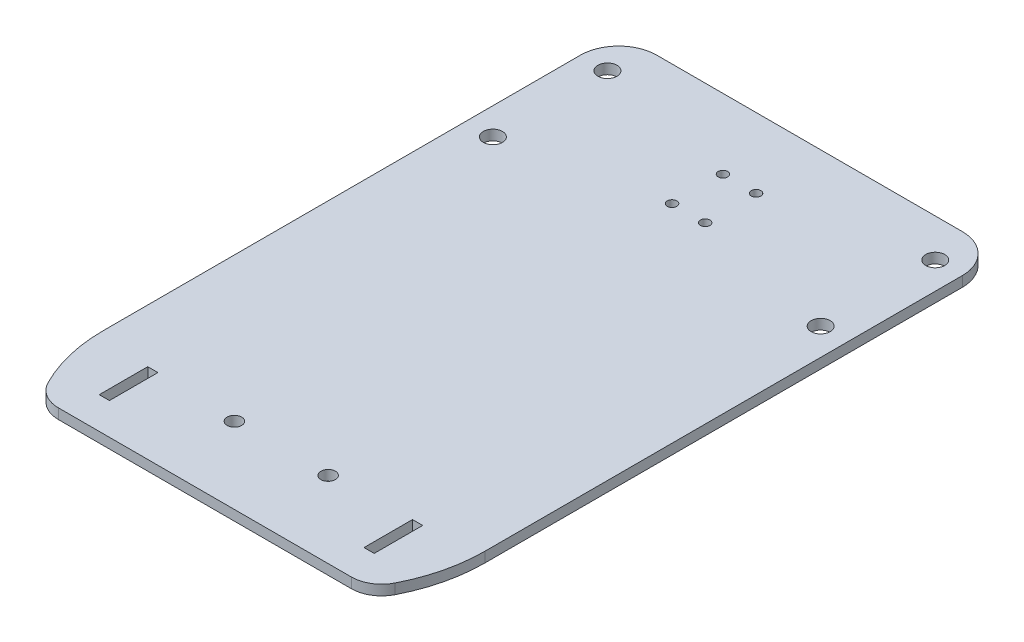
ISO-10303-21;
HEADER;
FILE_DESCRIPTION(('STEP AP214'),'2;1');
FILE_NAME('part.step','',(''),(''),'','','');
FILE_SCHEMA(('AUTOMOTIVE_DESIGN { 1 0 10303 214 1 1 1 1 }'));
ENDSEC;
DATA;
#1=APPLICATION_CONTEXT('core data for automotive mechanical design processes');
#2=APPLICATION_PROTOCOL_DEFINITION('international standard','automotive_design',2000,#1);
#3=PRODUCT_CONTEXT('',#1,'mechanical');
#4=PRODUCT('Part','Part','',(#3));
#5=PRODUCT_RELATED_PRODUCT_CATEGORY('part','',(#4));
#6=PRODUCT_DEFINITION_FORMATION('','',#4);
#7=PRODUCT_DEFINITION_CONTEXT('part definition',#1,'design');
#8=PRODUCT_DEFINITION('design','',#6,#7);
#9=PRODUCT_DEFINITION_SHAPE('','',#8);
#10=(LENGTH_UNIT() NAMED_UNIT(*) SI_UNIT(.MILLI.,.METRE.));
#11=(NAMED_UNIT(*) PLANE_ANGLE_UNIT() SI_UNIT($,.RADIAN.));
#12=(NAMED_UNIT(*) SI_UNIT($,.STERADIAN.) SOLID_ANGLE_UNIT());
#13=UNCERTAINTY_MEASURE_WITH_UNIT(LENGTH_MEASURE(1.E-05),#10,'distance_accuracy_value','');
#14=(GEOMETRIC_REPRESENTATION_CONTEXT(3) GLOBAL_UNCERTAINTY_ASSIGNED_CONTEXT((#13)) GLOBAL_UNIT_ASSIGNED_CONTEXT((#10,
#11,#12)) REPRESENTATION_CONTEXT('',''));
#15=CARTESIAN_POINT('',(0.,0.,0.));
#16=DIRECTION('',(0.,0.,1.));
#17=DIRECTION('',(1.,0.,0.));
#18=AXIS2_PLACEMENT_3D('',#15,#16,#17);
#19=CARTESIAN_POINT('',(-30.,0.8,0.));
#20=DIRECTION('',(1.,0.,0.));
#21=DIRECTION('',(0.,0.,-1.));
#22=AXIS2_PLACEMENT_3D('',#19,#20,#21);
#23=PLANE('',#22);
#24=DIRECTION('',(0.,0.,1.));
#25=VECTOR('',#24,1.);
#26=CARTESIAN_POINT('',(-30.,-0.8,0.));
#27=LINE('',#26,#25);
#28=CARTESIAN_POINT('',(-30.,-0.8,6.));
#29=VERTEX_POINT('',#28);
#30=CARTESIAN_POINT('',(-30.,-0.8,81.));
#31=VERTEX_POINT('',#30);
#32=EDGE_CURVE('E269',#29,#31,#27,.T.);
#33=ORIENTED_EDGE('',*,*,#32,.T.);
#34=DIRECTION('',(0.,1.,0.));
#35=VECTOR('',#34,1.);
#36=CARTESIAN_POINT('',(-30.,-0.8,81.));
#37=LINE('',#36,#35);
#38=CARTESIAN_POINT('',(-30.,0.8,81.));
#39=VERTEX_POINT('',#38);
#40=EDGE_CURVE('E266',#31,#39,#37,.T.);
#41=ORIENTED_EDGE('',*,*,#40,.T.);
#42=DIRECTION('',(0.,0.,1.));
#43=VECTOR('',#42,1.);
#44=CARTESIAN_POINT('',(-30.,0.8,0.));
#45=LINE('',#44,#43);
#46=CARTESIAN_POINT('',(-30.,0.8,6.));
#47=VERTEX_POINT('',#46);
#48=EDGE_CURVE('E290',#47,#39,#45,.T.);
#49=ORIENTED_EDGE('',*,*,#48,.F.);
#50=DIRECTION('',(0.,1.,0.));
#51=VECTOR('',#50,1.);
#52=CARTESIAN_POINT('',(-30.,-0.8,6.));
#53=LINE('',#52,#51);
#54=EDGE_CURVE('E270',#29,#47,#53,.T.);
#55=ORIENTED_EDGE('',*,*,#54,.F.);
#56=EDGE_LOOP('',(#33,#41,#49,#55));
#57=FACE_BOUND('',#56,.T.);
#58=ADVANCED_FACE('F36',(#57),#23,.F.);
#59=CARTESIAN_POINT('',(-30.,0.8,95.));
#60=DIRECTION('',(0.,0.,-1.));
#61=DIRECTION('',(-1.,0.,0.));
#62=AXIS2_PLACEMENT_3D('',#59,#60,#61);
#63=PLANE('',#62);
#64=DIRECTION('',(1.,0.,0.));
#65=VECTOR('',#64,1.);
#66=CARTESIAN_POINT('',(-30.,-0.8,95.));
#67=LINE('',#66,#65);
#68=CARTESIAN_POINT('',(-23.,-0.8,95.));
#69=VERTEX_POINT('',#68);
#70=CARTESIAN_POINT('',(23.,-0.8,95.));
#71=VERTEX_POINT('',#70);
#72=EDGE_CURVE('E300',#69,#71,#67,.T.);
#73=ORIENTED_EDGE('',*,*,#72,.T.);
#74=DIRECTION('',(0.,1.,0.));
#75=VECTOR('',#74,1.);
#76=CARTESIAN_POINT('',(23.,-0.8,95.));
#77=LINE('',#76,#75);
#78=CARTESIAN_POINT('',(23.,0.8,95.));
#79=VERTEX_POINT('',#78);
#80=EDGE_CURVE('E284',#71,#79,#77,.T.);
#81=ORIENTED_EDGE('',*,*,#80,.T.);
#82=DIRECTION('',(1.,0.,0.));
#83=VECTOR('',#82,1.);
#84=CARTESIAN_POINT('',(-30.,0.8,95.));
#85=LINE('',#84,#83);
#86=CARTESIAN_POINT('',(-23.,0.8,95.));
#87=VERTEX_POINT('',#86);
#88=EDGE_CURVE('E293',#87,#79,#85,.T.);
#89=ORIENTED_EDGE('',*,*,#88,.F.);
#90=DIRECTION('',(0.,1.,0.));
#91=VECTOR('',#90,1.);
#92=CARTESIAN_POINT('',(-23.,-0.8,95.));
#93=LINE('',#92,#91);
#94=EDGE_CURVE('E287',#69,#87,#93,.T.);
#95=ORIENTED_EDGE('',*,*,#94,.F.);
#96=EDGE_LOOP('',(#73,#81,#89,#95));
#97=FACE_BOUND('',#96,.T.);
#98=ADVANCED_FACE('F339',(#97),#63,.F.);
#99=CARTESIAN_POINT('',(30.,0.8,0.));
#100=DIRECTION('',(-1.,0.,0.));
#101=DIRECTION('',(0.,0.,1.));
#102=AXIS2_PLACEMENT_3D('',#99,#100,#101);
#103=PLANE('',#102);
#104=DIRECTION('',(0.,0.,-1.));
#105=VECTOR('',#104,1.);
#106=CARTESIAN_POINT('',(30.,-0.8,0.));
#107=LINE('',#106,#105);
#108=CARTESIAN_POINT('',(30.,-0.8,81.));
#109=VERTEX_POINT('',#108);
#110=CARTESIAN_POINT('',(30.,-0.8,6.00000000000001));
#111=VERTEX_POINT('',#110);
#112=EDGE_CURVE('E302',#109,#111,#107,.T.);
#113=ORIENTED_EDGE('',*,*,#112,.T.);
#114=DIRECTION('',(0.,1.,0.));
#115=VECTOR('',#114,1.);
#116=CARTESIAN_POINT('',(30.,-0.8,6.00000000000001));
#117=LINE('',#116,#115);
#118=CARTESIAN_POINT('',(30.,0.8,6.00000000000001));
#119=VERTEX_POINT('',#118);
#120=EDGE_CURVE('E277',#111,#119,#117,.T.);
#121=ORIENTED_EDGE('',*,*,#120,.T.);
#122=DIRECTION('',(0.,0.,-1.));
#123=VECTOR('',#122,1.);
#124=CARTESIAN_POINT('',(30.,0.8,0.));
#125=LINE('',#124,#123);
#126=CARTESIAN_POINT('',(30.,0.8,81.));
#127=VERTEX_POINT('',#126);
#128=EDGE_CURVE('E44',#127,#119,#125,.T.);
#129=ORIENTED_EDGE('',*,*,#128,.F.);
#130=DIRECTION('',(0.,1.,0.));
#131=VECTOR('',#130,1.);
#132=CARTESIAN_POINT('',(30.,-0.8,81.));
#133=LINE('',#132,#131);
#134=EDGE_CURVE('E280',#109,#127,#133,.T.);
#135=ORIENTED_EDGE('',*,*,#134,.F.);
#136=EDGE_LOOP('',(#113,#121,#129,#135));
#137=FACE_BOUND('',#136,.T.);
#138=ADVANCED_FACE('F328',(#137),#103,.F.);
#139=CARTESIAN_POINT('',(-30.,0.8,0.));
#140=DIRECTION('',(0.,0.,1.));
#141=DIRECTION('',(1.,0.,0.));
#142=AXIS2_PLACEMENT_3D('',#139,#140,#141);
#143=PLANE('',#142);
#144=DIRECTION('',(-1.,0.,0.));
#145=VECTOR('',#144,1.);
#146=CARTESIAN_POINT('',(-30.,-0.8,0.));
#147=LINE('',#146,#145);
#148=CARTESIAN_POINT('',(24.,-0.8,0.));
#149=VERTEX_POINT('',#148);
#150=CARTESIAN_POINT('',(-24.,-0.8,0.));
#151=VERTEX_POINT('',#150);
#152=EDGE_CURVE('E39',#149,#151,#147,.T.);
#153=ORIENTED_EDGE('',*,*,#152,.T.);
#154=DIRECTION('',(0.,1.,0.));
#155=VECTOR('',#154,1.);
#156=CARTESIAN_POINT('',(-24.,-0.8,0.));
#157=LINE('',#156,#155);
#158=CARTESIAN_POINT('',(-24.,0.8,0.));
#159=VERTEX_POINT('',#158);
#160=EDGE_CURVE('E272',#151,#159,#157,.T.);
#161=ORIENTED_EDGE('',*,*,#160,.T.);
#162=DIRECTION('',(-1.,0.,0.));
#163=VECTOR('',#162,1.);
#164=CARTESIAN_POINT('',(-30.,0.8,0.));
#165=LINE('',#164,#163);
#166=CARTESIAN_POINT('',(24.,0.8,0.));
#167=VERTEX_POINT('',#166);
#168=EDGE_CURVE('E12',#167,#159,#165,.T.);
#169=ORIENTED_EDGE('',*,*,#168,.F.);
#170=DIRECTION('',(0.,1.,0.));
#171=VECTOR('',#170,1.);
#172=CARTESIAN_POINT('',(24.,-0.8,0.));
#173=LINE('',#172,#171);
#174=EDGE_CURVE('E275',#149,#167,#173,.T.);
#175=ORIENTED_EDGE('',*,*,#174,.F.);
#176=EDGE_LOOP('',(#153,#161,#169,#175));
#177=FACE_BOUND('',#176,.T.);
#178=ADVANCED_FACE('F311',(#177),#143,.F.);
#179=CARTESIAN_POINT('',(-30.,0.8,95.));
#180=DIRECTION('',(0.,1.,0.));
#181=DIRECTION('',(0.,0.,1.));
#182=AXIS2_PLACEMENT_3D('',#179,#180,#181);
#183=PLANE('',#182);
#184=CARTESIAN_POINT('',(2.60000000000001,0.8,11.));
#185=DIRECTION('',(0.,1.,0.));
#186=DIRECTION('',(0.,0.,-1.));
#187=AXIS2_PLACEMENT_3D('',#184,#185,#186);
#188=CIRCLE('',#187,0.750000000000001);
#189=CARTESIAN_POINT('',(2.60000000000001,0.8,10.25));
#190=VERTEX_POINT('',#189);
#191=EDGE_CURVE('E377',#190,#190,#188,.T.);
#192=ORIENTED_EDGE('',*,*,#191,.F.);
#193=EDGE_LOOP('',(#192));
#194=FACE_BOUND('',#193,.T.);
#195=CARTESIAN_POINT('',(2.60000000000001,0.8,19.));
#196=DIRECTION('',(0.,1.,0.));
#197=DIRECTION('',(0.,0.,-1.));
#198=AXIS2_PLACEMENT_3D('',#195,#196,#197);
#199=CIRCLE('',#198,0.750000000000001);
#200=CARTESIAN_POINT('',(2.60000000000001,0.8,18.25));
#201=VERTEX_POINT('',#200);
#202=EDGE_CURVE('E381',#201,#201,#199,.T.);
#203=ORIENTED_EDGE('',*,*,#202,.F.);
#204=EDGE_LOOP('',(#203));
#205=FACE_BOUND('',#204,.T.);
#206=CARTESIAN_POINT('',(-2.6,0.8,19.));
#207=DIRECTION('',(0.,1.,0.));
#208=DIRECTION('',(0.,0.,1.));
#209=AXIS2_PLACEMENT_3D('',#206,#207,#208);
#210=CIRCLE('',#209,0.750000000000001);
#211=CARTESIAN_POINT('',(-2.6,0.8,19.75));
#212=VERTEX_POINT('',#211);
#213=EDGE_CURVE('E385',#212,#212,#210,.T.);
#214=ORIENTED_EDGE('',*,*,#213,.F.);
#215=EDGE_LOOP('',(#214));
#216=FACE_BOUND('',#215,.T.);
#217=CARTESIAN_POINT('',(-2.6,0.8,11.));
#218=DIRECTION('',(0.,1.,0.));
#219=DIRECTION('',(0.,0.,1.));
#220=AXIS2_PLACEMENT_3D('',#217,#218,#219);
#221=CIRCLE('',#220,0.750000000000001);
#222=CARTESIAN_POINT('',(-2.6,0.8,11.75));
#223=VERTEX_POINT('',#222);
#224=EDGE_CURVE('E389',#223,#223,#221,.T.);
#225=ORIENTED_EDGE('',*,*,#224,.F.);
#226=EDGE_LOOP('',(#225));
#227=FACE_BOUND('',#226,.T.);
#228=CARTESIAN_POINT('',(7.366,0.8,83.));
#229=DIRECTION('',(0.,-1.,0.));
#230=DIRECTION('',(0.,0.,-1.));
#231=AXIS2_PLACEMENT_3D('',#228,#229,#230);
#232=CIRCLE('',#231,1.143);
#233=CARTESIAN_POINT('',(7.366,0.8,81.857));
#234=VERTEX_POINT('',#233);
#235=EDGE_CURVE('E393',#234,#234,#232,.T.);
#236=ORIENTED_EDGE('',*,*,#235,.T.);
#237=EDGE_LOOP('',(#236));
#238=FACE_BOUND('',#237,.T.);
#239=CARTESIAN_POINT('',(-7.366,0.8,83.));
#240=DIRECTION('',(0.,-1.,0.));
#241=DIRECTION('',(0.,0.,-1.));
#242=AXIS2_PLACEMENT_3D('',#239,#240,#241);
#243=CIRCLE('',#242,1.143);
#244=CARTESIAN_POINT('',(-7.366,0.8,81.857));
#245=VERTEX_POINT('',#244);
#246=EDGE_CURVE('E397',#245,#245,#243,.T.);
#247=ORIENTED_EDGE('',*,*,#246,.T.);
#248=EDGE_LOOP('',(#247));
#249=FACE_BOUND('',#248,.T.);
#250=CARTESIAN_POINT('',(25.75,0.8,6.));
#251=DIRECTION('',(0.,1.,0.));
#252=DIRECTION('',(0.,0.,-1.));
#253=AXIS2_PLACEMENT_3D('',#250,#251,#252);
#254=CIRCLE('',#253,1.50000000000007);
#255=CARTESIAN_POINT('',(25.75,0.8,4.49999999999993));
#256=VERTEX_POINT('',#255);
#257=EDGE_CURVE('E401',#256,#256,#254,.T.);
#258=ORIENTED_EDGE('',*,*,#257,.F.);
#259=EDGE_LOOP('',(#258));
#260=FACE_BOUND('',#259,.T.);
#261=CARTESIAN_POINT('',(25.75,0.8,24.));
#262=DIRECTION('',(0.,1.,0.));
#263=DIRECTION('',(0.,0.,-1.));
#264=AXIS2_PLACEMENT_3D('',#261,#262,#263);
#265=CIRCLE('',#264,1.50000000000007);
#266=CARTESIAN_POINT('',(25.75,0.8,22.4999999999999));
#267=VERTEX_POINT('',#266);
#268=EDGE_CURVE('E405',#267,#267,#265,.T.);
#269=ORIENTED_EDGE('',*,*,#268,.F.);
#270=EDGE_LOOP('',(#269));
#271=FACE_BOUND('',#270,.T.);
#272=CARTESIAN_POINT('',(-25.75,0.8,24.));
#273=DIRECTION('',(0.,1.,0.));
#274=DIRECTION('',(0.,0.,1.));
#275=AXIS2_PLACEMENT_3D('',#272,#273,#274);
#276=CIRCLE('',#275,1.49999999999993);
#277=CARTESIAN_POINT('',(-25.75,0.8,25.4999999999999));
#278=VERTEX_POINT('',#277);
#279=EDGE_CURVE('E409',#278,#278,#276,.T.);
#280=ORIENTED_EDGE('',*,*,#279,.F.);
#281=EDGE_LOOP('',(#280));
#282=FACE_BOUND('',#281,.T.);
#283=CARTESIAN_POINT('',(-25.75,0.8,6.00000000000001));
#284=DIRECTION('',(0.,1.,0.));
#285=DIRECTION('',(0.,0.,1.));
#286=AXIS2_PLACEMENT_3D('',#283,#284,#285);
#287=CIRCLE('',#286,1.49999999999993);
#288=CARTESIAN_POINT('',(-25.75,0.8,7.49999999999994));
#289=VERTEX_POINT('',#288);
#290=EDGE_CURVE('E186',#289,#289,#287,.T.);
#291=ORIENTED_EDGE('',*,*,#290,.F.);
#292=EDGE_LOOP('',(#291));
#293=FACE_BOUND('',#292,.T.);
#294=DIRECTION('',(-1.,0.,0.));
#295=VECTOR('',#294,1.);
#296=CARTESIAN_POINT('',(20.,0.8,82.38));
#297=LINE('',#296,#295);
#298=CARTESIAN_POINT('',(21.6,0.8,82.38));
#299=VERTEX_POINT('',#298);
#300=CARTESIAN_POINT('',(20.,0.8,82.38));
#301=VERTEX_POINT('',#300);
#302=EDGE_CURVE('E52',#299,#301,#297,.T.);
#303=ORIENTED_EDGE('',*,*,#302,.F.);
#304=DIRECTION('',(0.,0.,-1.));
#305=VECTOR('',#304,1.);
#306=CARTESIAN_POINT('',(21.6,0.8,82.38));
#307=LINE('',#306,#305);
#308=CARTESIAN_POINT('',(21.6,0.8,90.));
#309=VERTEX_POINT('',#308);
#310=EDGE_CURVE('E180',#309,#299,#307,.T.);
#311=ORIENTED_EDGE('',*,*,#310,.F.);
#312=DIRECTION('',(1.,0.,0.));
#313=VECTOR('',#312,1.);
#314=CARTESIAN_POINT('',(20.,0.8,90.));
#315=LINE('',#314,#313);
#316=CARTESIAN_POINT('',(20.,0.8,90.));
#317=VERTEX_POINT('',#316);
#318=EDGE_CURVE('E183',#317,#309,#315,.T.);
#319=ORIENTED_EDGE('',*,*,#318,.F.);
#320=DIRECTION('',(0.,0.,1.));
#321=VECTOR('',#320,1.);
#322=CARTESIAN_POINT('',(20.,0.8,82.38));
#323=LINE('',#322,#321);
#324=EDGE_CURVE('E192',#301,#317,#323,.T.);
#325=ORIENTED_EDGE('',*,*,#324,.F.);
#326=EDGE_LOOP('',(#303,#311,#319,#325));
#327=FACE_BOUND('',#326,.T.);
#328=DIRECTION('',(0.,0.,-1.));
#329=VECTOR('',#328,1.);
#330=CARTESIAN_POINT('',(-20.,0.8,82.38));
#331=LINE('',#330,#329);
#332=CARTESIAN_POINT('',(-20.,0.8,90.));
#333=VERTEX_POINT('',#332);
#334=CARTESIAN_POINT('',(-20.,0.8,82.38));
#335=VERTEX_POINT('',#334);
#336=EDGE_CURVE('E199',#333,#335,#331,.T.);
#337=ORIENTED_EDGE('',*,*,#336,.F.);
#338=DIRECTION('',(1.,0.,0.));
#339=VECTOR('',#338,1.);
#340=CARTESIAN_POINT('',(-20.,0.8,90.));
#341=LINE('',#340,#339);
#342=CARTESIAN_POINT('',(-21.6,0.8,90.));
#343=VERTEX_POINT('',#342);
#344=EDGE_CURVE('E207',#343,#333,#341,.T.);
#345=ORIENTED_EDGE('',*,*,#344,.F.);
#346=DIRECTION('',(0.,0.,1.));
#347=VECTOR('',#346,1.);
#348=CARTESIAN_POINT('',(-21.6,0.8,82.38));
#349=LINE('',#348,#347);
#350=CARTESIAN_POINT('',(-21.6,0.8,82.38));
#351=VERTEX_POINT('',#350);
#352=EDGE_CURVE('E221',#351,#343,#349,.T.);
#353=ORIENTED_EDGE('',*,*,#352,.F.);
#354=DIRECTION('',(-1.,0.,0.));
#355=VECTOR('',#354,1.);
#356=CARTESIAN_POINT('',(-20.,0.8,82.38));
#357=LINE('',#356,#355);
#358=EDGE_CURVE('E218',#335,#351,#357,.T.);
#359=ORIENTED_EDGE('',*,*,#358,.F.);
#360=EDGE_LOOP('',(#337,#345,#353,#359));
#361=FACE_BOUND('',#360,.T.);
#362=ORIENTED_EDGE('',*,*,#168,.T.);
#363=CARTESIAN_POINT('',(-24.,0.8,6.00000000000001));
#364=DIRECTION('',(0.,1.,0.));
#365=DIRECTION('',(0.,0.,1.));
#366=AXIS2_PLACEMENT_3D('',#363,#364,#365);
#367=CIRCLE('',#366,6.);
#368=EDGE_CURVE('E238',#159,#47,#367,.T.);
#369=ORIENTED_EDGE('',*,*,#368,.T.);
#370=ORIENTED_EDGE('',*,*,#48,.T.);
#371=CARTESIAN_POINT('',(-5.,0.8,81.));
#372=DIRECTION('',(0.,1.,0.));
#373=DIRECTION('',(0.,0.,-1.));
#374=AXIS2_PLACEMENT_3D('',#371,#372,#373);
#375=CIRCLE('',#374,25.);
#376=CARTESIAN_POINT('',(-27.247191011236,0.8,92.4044943820225));
#377=VERTEX_POINT('',#376);
#378=EDGE_CURVE('E228',#39,#377,#375,.T.);
#379=ORIENTED_EDGE('',*,*,#378,.T.);
#380=CARTESIAN_POINT('',(-23.,0.8,90.2272727272727));
#381=DIRECTION('',(0.,1.,0.));
#382=DIRECTION('',(0.,0.,-1.));
#383=AXIS2_PLACEMENT_3D('',#380,#381,#382);
#384=CIRCLE('',#383,4.77272727272727);
#385=EDGE_CURVE('E252',#377,#87,#384,.T.);
#386=ORIENTED_EDGE('',*,*,#385,.T.);
#387=ORIENTED_EDGE('',*,*,#88,.T.);
#388=CARTESIAN_POINT('',(23.,0.8,90.2272727272727));
#389=DIRECTION('',(0.,1.,0.));
#390=DIRECTION('',(0.,0.,1.));
#391=AXIS2_PLACEMENT_3D('',#388,#389,#390);
#392=CIRCLE('',#391,4.77272727272727);
#393=CARTESIAN_POINT('',(27.247191011236,0.8,92.4044943820225));
#394=VERTEX_POINT('',#393);
#395=EDGE_CURVE('E255',#79,#394,#392,.T.);
#396=ORIENTED_EDGE('',*,*,#395,.T.);
#397=CARTESIAN_POINT('',(5.,0.8,81.));
#398=DIRECTION('',(0.,1.,0.));
#399=DIRECTION('',(0.,0.,1.));
#400=AXIS2_PLACEMENT_3D('',#397,#398,#399);
#401=CIRCLE('',#400,25.);
#402=EDGE_CURVE('E258',#394,#127,#401,.T.);
#403=ORIENTED_EDGE('',*,*,#402,.T.);
#404=ORIENTED_EDGE('',*,*,#128,.T.);
#405=CARTESIAN_POINT('',(24.,0.8,6.00000000000001));
#406=DIRECTION('',(0.,1.,0.));
#407=DIRECTION('',(0.,0.,-1.));
#408=AXIS2_PLACEMENT_3D('',#405,#406,#407);
#409=CIRCLE('',#408,6.);
#410=EDGE_CURVE('E261',#119,#167,#409,.T.);
#411=ORIENTED_EDGE('',*,*,#410,.T.);
#412=EDGE_LOOP('',(#362,#369,#370,#379,#386,#387,#396,#403,#404,#411));
#413=FACE_BOUND('',#412,.T.);
#414=ADVANCED_FACE('F324',(#194,#205,#216,#227,#238,#249,#260,#271,#282,#293,#327,#361,#413),
#183,.T.);
#415=CARTESIAN_POINT('',(-30.,-0.8,95.));
#416=DIRECTION('',(0.,1.,0.));
#417=DIRECTION('',(0.,0.,1.));
#418=AXIS2_PLACEMENT_3D('',#415,#416,#417);
#419=PLANE('',#418);
#420=CARTESIAN_POINT('',(2.60000000000001,-0.8,11.));
#421=DIRECTION('',(0.,1.,0.));
#422=DIRECTION('',(0.,0.,-1.));
#423=AXIS2_PLACEMENT_3D('',#420,#421,#422);
#424=CIRCLE('',#423,0.750000000000001);
#425=CARTESIAN_POINT('',(2.60000000000001,-0.8,10.25));
#426=VERTEX_POINT('',#425);
#427=EDGE_CURVE('E633',#426,#426,#424,.T.);
#428=ORIENTED_EDGE('',*,*,#427,.T.);
#429=EDGE_LOOP('',(#428));
#430=FACE_BOUND('',#429,.T.);
#431=CARTESIAN_POINT('',(2.60000000000001,-0.8,19.));
#432=DIRECTION('',(0.,1.,0.));
#433=DIRECTION('',(0.,0.,-1.));
#434=AXIS2_PLACEMENT_3D('',#431,#432,#433);
#435=CIRCLE('',#434,0.750000000000001);
#436=CARTESIAN_POINT('',(2.60000000000001,-0.8,18.25));
#437=VERTEX_POINT('',#436);
#438=EDGE_CURVE('E637',#437,#437,#435,.T.);
#439=ORIENTED_EDGE('',*,*,#438,.T.);
#440=EDGE_LOOP('',(#439));
#441=FACE_BOUND('',#440,.T.);
#442=CARTESIAN_POINT('',(-2.6,-0.8,19.));
#443=DIRECTION('',(0.,1.,0.));
#444=DIRECTION('',(0.,0.,1.));
#445=AXIS2_PLACEMENT_3D('',#442,#443,#444);
#446=CIRCLE('',#445,0.750000000000001);
#447=CARTESIAN_POINT('',(-2.6,-0.8,19.75));
#448=VERTEX_POINT('',#447);
#449=EDGE_CURVE('E641',#448,#448,#446,.T.);
#450=ORIENTED_EDGE('',*,*,#449,.T.);
#451=EDGE_LOOP('',(#450));
#452=FACE_BOUND('',#451,.T.);
#453=CARTESIAN_POINT('',(-2.6,-0.8,11.));
#454=DIRECTION('',(0.,1.,0.));
#455=DIRECTION('',(0.,0.,1.));
#456=AXIS2_PLACEMENT_3D('',#453,#454,#455);
#457=CIRCLE('',#456,0.750000000000001);
#458=CARTESIAN_POINT('',(-2.6,-0.8,11.75));
#459=VERTEX_POINT('',#458);
#460=EDGE_CURVE('E645',#459,#459,#457,.T.);
#461=ORIENTED_EDGE('',*,*,#460,.T.);
#462=EDGE_LOOP('',(#461));
#463=FACE_BOUND('',#462,.T.);
#464=CARTESIAN_POINT('',(7.366,-0.8,83.));
#465=DIRECTION('',(0.,-1.,0.));
#466=DIRECTION('',(0.,0.,-1.));
#467=AXIS2_PLACEMENT_3D('',#464,#465,#466);
#468=CIRCLE('',#467,1.143);
#469=CARTESIAN_POINT('',(7.366,-0.8,81.857));
#470=VERTEX_POINT('',#469);
#471=EDGE_CURVE('E648',#470,#470,#468,.T.);
#472=ORIENTED_EDGE('',*,*,#471,.F.);
#473=EDGE_LOOP('',(#472));
#474=FACE_BOUND('',#473,.T.);
#475=CARTESIAN_POINT('',(-7.366,-0.8,83.));
#476=DIRECTION('',(0.,-1.,0.));
#477=DIRECTION('',(0.,0.,-1.));
#478=AXIS2_PLACEMENT_3D('',#475,#476,#477);
#479=CIRCLE('',#478,1.143);
#480=CARTESIAN_POINT('',(-7.366,-0.8,81.857));
#481=VERTEX_POINT('',#480);
#482=EDGE_CURVE('E651',#481,#481,#479,.T.);
#483=ORIENTED_EDGE('',*,*,#482,.F.);
#484=EDGE_LOOP('',(#483));
#485=FACE_BOUND('',#484,.T.);
#486=CARTESIAN_POINT('',(25.75,-0.8,6.));
#487=DIRECTION('',(0.,1.,0.));
#488=DIRECTION('',(0.,0.,-1.));
#489=AXIS2_PLACEMENT_3D('',#486,#487,#488);
#490=CIRCLE('',#489,1.50000000000007);
#491=CARTESIAN_POINT('',(25.75,-0.8,4.49999999999993));
#492=VERTEX_POINT('',#491);
#493=EDGE_CURVE('E657',#492,#492,#490,.T.);
#494=ORIENTED_EDGE('',*,*,#493,.T.);
#495=EDGE_LOOP('',(#494));
#496=FACE_BOUND('',#495,.T.);
#497=CARTESIAN_POINT('',(25.75,-0.8,24.));
#498=DIRECTION('',(0.,1.,0.));
#499=DIRECTION('',(0.,0.,-1.));
#500=AXIS2_PLACEMENT_3D('',#497,#498,#499);
#501=CIRCLE('',#500,1.50000000000007);
#502=CARTESIAN_POINT('',(25.75,-0.8,22.4999999999999));
#503=VERTEX_POINT('',#502);
#504=EDGE_CURVE('E661',#503,#503,#501,.T.);
#505=ORIENTED_EDGE('',*,*,#504,.T.);
#506=EDGE_LOOP('',(#505));
#507=FACE_BOUND('',#506,.T.);
#508=CARTESIAN_POINT('',(-25.75,-0.8,24.));
#509=DIRECTION('',(0.,1.,0.));
#510=DIRECTION('',(0.,0.,1.));
#511=AXIS2_PLACEMENT_3D('',#508,#509,#510);
#512=CIRCLE('',#511,1.49999999999993);
#513=CARTESIAN_POINT('',(-25.75,-0.8,25.4999999999999));
#514=VERTEX_POINT('',#513);
#515=EDGE_CURVE('E665',#514,#514,#512,.T.);
#516=ORIENTED_EDGE('',*,*,#515,.T.);
#517=EDGE_LOOP('',(#516));
#518=FACE_BOUND('',#517,.T.);
#519=CARTESIAN_POINT('',(-25.75,-0.8,6.00000000000001));
#520=DIRECTION('',(0.,1.,0.));
#521=DIRECTION('',(0.,0.,1.));
#522=AXIS2_PLACEMENT_3D('',#519,#520,#521);
#523=CIRCLE('',#522,1.49999999999993);
#524=CARTESIAN_POINT('',(-25.75,-0.8,7.49999999999994));
#525=VERTEX_POINT('',#524);
#526=EDGE_CURVE('E193',#525,#525,#523,.T.);
#527=ORIENTED_EDGE('',*,*,#526,.T.);
#528=EDGE_LOOP('',(#527));
#529=FACE_BOUND('',#528,.T.);
#530=DIRECTION('',(0.,0.,-1.));
#531=VECTOR('',#530,1.);
#532=CARTESIAN_POINT('',(21.6,-0.8,82.38));
#533=LINE('',#532,#531);
#534=CARTESIAN_POINT('',(21.6,-0.8,90.));
#535=VERTEX_POINT('',#534);
#536=CARTESIAN_POINT('',(21.6,-0.8,82.38));
#537=VERTEX_POINT('',#536);
#538=EDGE_CURVE('E170',#535,#537,#533,.T.);
#539=ORIENTED_EDGE('',*,*,#538,.T.);
#540=DIRECTION('',(-1.,0.,0.));
#541=VECTOR('',#540,1.);
#542=CARTESIAN_POINT('',(20.,-0.8,82.38));
#543=LINE('',#542,#541);
#544=CARTESIAN_POINT('',(20.,-0.8,82.38));
#545=VERTEX_POINT('',#544);
#546=EDGE_CURVE('E164',#537,#545,#543,.T.);
#547=ORIENTED_EDGE('',*,*,#546,.T.);
#548=DIRECTION('',(0.,0.,1.));
#549=VECTOR('',#548,1.);
#550=CARTESIAN_POINT('',(20.,-0.8,82.38));
#551=LINE('',#550,#549);
#552=CARTESIAN_POINT('',(20.,-0.8,90.));
#553=VERTEX_POINT('',#552);
#554=EDGE_CURVE('E173',#545,#553,#551,.T.);
#555=ORIENTED_EDGE('',*,*,#554,.T.);
#556=DIRECTION('',(1.,0.,0.));
#557=VECTOR('',#556,1.);
#558=CARTESIAN_POINT('',(20.,-0.8,90.));
#559=LINE('',#558,#557);
#560=EDGE_CURVE('E60',#553,#535,#559,.T.);
#561=ORIENTED_EDGE('',*,*,#560,.T.);
#562=EDGE_LOOP('',(#539,#547,#555,#561));
#563=FACE_BOUND('',#562,.T.);
#564=DIRECTION('',(1.,0.,0.));
#565=VECTOR('',#564,1.);
#566=CARTESIAN_POINT('',(-20.,-0.8,90.));
#567=LINE('',#566,#565);
#568=CARTESIAN_POINT('',(-21.6,-0.8,90.));
#569=VERTEX_POINT('',#568);
#570=CARTESIAN_POINT('',(-20.,-0.8,90.));
#571=VERTEX_POINT('',#570);
#572=EDGE_CURVE('E213',#569,#571,#567,.T.);
#573=ORIENTED_EDGE('',*,*,#572,.T.);
#574=DIRECTION('',(0.,0.,-1.));
#575=VECTOR('',#574,1.);
#576=CARTESIAN_POINT('',(-20.,-0.8,82.38));
#577=LINE('',#576,#575);
#578=CARTESIAN_POINT('',(-20.,-0.8,82.38));
#579=VERTEX_POINT('',#578);
#580=EDGE_CURVE('E203',#571,#579,#577,.T.);
#581=ORIENTED_EDGE('',*,*,#580,.T.);
#582=DIRECTION('',(-1.,0.,0.));
#583=VECTOR('',#582,1.);
#584=CARTESIAN_POINT('',(-20.,-0.8,82.38));
#585=LINE('',#584,#583);
#586=CARTESIAN_POINT('',(-21.6,-0.8,82.38));
#587=VERTEX_POINT('',#586);
#588=EDGE_CURVE('E206',#579,#587,#585,.T.);
#589=ORIENTED_EDGE('',*,*,#588,.T.);
#590=DIRECTION('',(0.,0.,1.));
#591=VECTOR('',#590,1.);
#592=CARTESIAN_POINT('',(-21.6,-0.8,82.38));
#593=LINE('',#592,#591);
#594=EDGE_CURVE('E210',#587,#569,#593,.T.);
#595=ORIENTED_EDGE('',*,*,#594,.T.);
#596=EDGE_LOOP('',(#573,#581,#589,#595));
#597=FACE_BOUND('',#596,.T.);
#598=CARTESIAN_POINT('',(-24.,-0.8,6.00000000000001));
#599=DIRECTION('',(0.,1.,0.));
#600=DIRECTION('',(0.,0.,1.));
#601=AXIS2_PLACEMENT_3D('',#598,#599,#600);
#602=CIRCLE('',#601,6.);
#603=EDGE_CURVE('E247',#151,#29,#602,.T.);
#604=ORIENTED_EDGE('',*,*,#603,.F.);
#605=ORIENTED_EDGE('',*,*,#152,.F.);
#606=CARTESIAN_POINT('',(24.,-0.8,6.00000000000001));
#607=DIRECTION('',(0.,1.,0.));
#608=DIRECTION('',(0.,0.,-1.));
#609=AXIS2_PLACEMENT_3D('',#606,#607,#608);
#610=CIRCLE('',#609,6.);
#611=EDGE_CURVE('E245',#111,#149,#610,.T.);
#612=ORIENTED_EDGE('',*,*,#611,.F.);
#613=ORIENTED_EDGE('',*,*,#112,.F.);
#614=CARTESIAN_POINT('',(5.,-0.8,81.));
#615=DIRECTION('',(0.,1.,0.));
#616=DIRECTION('',(0.,0.,1.));
#617=AXIS2_PLACEMENT_3D('',#614,#615,#616);
#618=CIRCLE('',#617,25.);
#619=CARTESIAN_POINT('',(27.247191011236,-0.8,92.4044943820225));
#620=VERTEX_POINT('',#619);
#621=EDGE_CURVE('E243',#620,#109,#618,.T.);
#622=ORIENTED_EDGE('',*,*,#621,.F.);
#623=CARTESIAN_POINT('',(23.,-0.8,90.2272727272727));
#624=DIRECTION('',(0.,1.,0.));
#625=DIRECTION('',(0.,0.,1.));
#626=AXIS2_PLACEMENT_3D('',#623,#624,#625);
#627=CIRCLE('',#626,4.77272727272727);
#628=EDGE_CURVE('E240',#71,#620,#627,.T.);
#629=ORIENTED_EDGE('',*,*,#628,.F.);
#630=ORIENTED_EDGE('',*,*,#72,.F.);
#631=CARTESIAN_POINT('',(-23.,-0.8,90.2272727272727));
#632=DIRECTION('',(0.,1.,0.));
#633=DIRECTION('',(0.,0.,-1.));
#634=AXIS2_PLACEMENT_3D('',#631,#632,#633);
#635=CIRCLE('',#634,4.77272727272727);
#636=CARTESIAN_POINT('',(-27.247191011236,-0.8,92.4044943820225));
#637=VERTEX_POINT('',#636);
#638=EDGE_CURVE('E237',#637,#69,#635,.T.);
#639=ORIENTED_EDGE('',*,*,#638,.F.);
#640=CARTESIAN_POINT('',(-5.,-0.8,81.));
#641=DIRECTION('',(0.,1.,0.));
#642=DIRECTION('',(0.,0.,-1.));
#643=AXIS2_PLACEMENT_3D('',#640,#641,#642);
#644=CIRCLE('',#643,25.);
#645=EDGE_CURVE('E235',#31,#637,#644,.T.);
#646=ORIENTED_EDGE('',*,*,#645,.F.);
#647=ORIENTED_EDGE('',*,*,#32,.F.);
#648=EDGE_LOOP('',(#604,#605,#612,#613,#622,#629,#630,#639,#646,#647));
#649=FACE_BOUND('',#648,.T.);
#650=ADVANCED_FACE('F177',(#430,#441,#452,#463,#474,#485,#496,#507,#518,#529,#563,#597,#649),
#419,.F.);
#651=CARTESIAN_POINT('',(-23.,-0.8,90.2272727272727));
#652=DIRECTION('',(0.,1.,0.));
#653=DIRECTION('',(0.,0.,1.));
#654=AXIS2_PLACEMENT_3D('',#651,#652,#653);
#655=CYLINDRICAL_SURFACE('',#654,4.77272727272727);
#656=ORIENTED_EDGE('',*,*,#385,.F.);
#657=DIRECTION('',(0.,1.,0.));
#658=VECTOR('',#657,1.);
#659=CARTESIAN_POINT('',(-27.247191011236,-0.8,92.4044943820225));
#660=LINE('',#659,#658);
#661=EDGE_CURVE('E249',#637,#377,#660,.T.);
#662=ORIENTED_EDGE('',*,*,#661,.F.);
#663=ORIENTED_EDGE('',*,*,#638,.T.);
#664=ORIENTED_EDGE('',*,*,#94,.T.);
#665=EDGE_LOOP('',(#656,#662,#663,#664));
#666=FACE_BOUND('',#665,.T.);
#667=ADVANCED_FACE('F344',(#666),#655,.T.);
#668=CARTESIAN_POINT('',(-5.,-0.8,81.));
#669=DIRECTION('',(0.,1.,0.));
#670=DIRECTION('',(0.,0.,1.));
#671=AXIS2_PLACEMENT_3D('',#668,#669,#670);
#672=CYLINDRICAL_SURFACE('',#671,25.);
#673=ORIENTED_EDGE('',*,*,#378,.F.);
#674=ORIENTED_EDGE('',*,*,#40,.F.);
#675=ORIENTED_EDGE('',*,*,#645,.T.);
#676=ORIENTED_EDGE('',*,*,#661,.T.);
#677=EDGE_LOOP('',(#673,#674,#675,#676));
#678=FACE_BOUND('',#677,.T.);
#679=ADVANCED_FACE('F347',(#678),#672,.T.);
#680=CARTESIAN_POINT('',(23.,-0.8,90.2272727272727));
#681=DIRECTION('',(0.,1.,0.));
#682=DIRECTION('',(0.,0.,1.));
#683=AXIS2_PLACEMENT_3D('',#680,#681,#682);
#684=CYLINDRICAL_SURFACE('',#683,4.77272727272727);
#685=ORIENTED_EDGE('',*,*,#395,.F.);
#686=ORIENTED_EDGE('',*,*,#80,.F.);
#687=ORIENTED_EDGE('',*,*,#628,.T.);
#688=DIRECTION('',(0.,1.,0.));
#689=VECTOR('',#688,1.);
#690=CARTESIAN_POINT('',(27.247191011236,-0.8,92.4044943820225));
#691=LINE('',#690,#689);
#692=EDGE_CURVE('E282',#620,#394,#691,.T.);
#693=ORIENTED_EDGE('',*,*,#692,.T.);
#694=EDGE_LOOP('',(#685,#686,#687,#693));
#695=FACE_BOUND('',#694,.T.);
#696=ADVANCED_FACE('F336',(#695),#684,.T.);
#697=CARTESIAN_POINT('',(5.,-0.8,81.));
#698=DIRECTION('',(0.,1.,0.));
#699=DIRECTION('',(0.,0.,1.));
#700=AXIS2_PLACEMENT_3D('',#697,#698,#699);
#701=CYLINDRICAL_SURFACE('',#700,25.);
#702=ORIENTED_EDGE('',*,*,#402,.F.);
#703=ORIENTED_EDGE('',*,*,#692,.F.);
#704=ORIENTED_EDGE('',*,*,#621,.T.);
#705=ORIENTED_EDGE('',*,*,#134,.T.);
#706=EDGE_LOOP('',(#702,#703,#704,#705));
#707=FACE_BOUND('',#706,.T.);
#708=ADVANCED_FACE('F334',(#707),#701,.T.);
#709=CARTESIAN_POINT('',(24.,-0.8,6.00000000000001));
#710=DIRECTION('',(0.,1.,0.));
#711=DIRECTION('',(0.,0.,1.));
#712=AXIS2_PLACEMENT_3D('',#709,#710,#711);
#713=CYLINDRICAL_SURFACE('',#712,6.);
#714=ORIENTED_EDGE('',*,*,#410,.F.);
#715=ORIENTED_EDGE('',*,*,#120,.F.);
#716=ORIENTED_EDGE('',*,*,#611,.T.);
#717=ORIENTED_EDGE('',*,*,#174,.T.);
#718=EDGE_LOOP('',(#714,#715,#716,#717));
#719=FACE_BOUND('',#718,.T.);
#720=ADVANCED_FACE('F327',(#719),#713,.T.);
#721=CARTESIAN_POINT('',(-24.,-0.8,6.00000000000001));
#722=DIRECTION('',(0.,1.,0.));
#723=DIRECTION('',(0.,0.,1.));
#724=AXIS2_PLACEMENT_3D('',#721,#722,#723);
#725=CYLINDRICAL_SURFACE('',#724,6.);
#726=ORIENTED_EDGE('',*,*,#368,.F.);
#727=ORIENTED_EDGE('',*,*,#160,.F.);
#728=ORIENTED_EDGE('',*,*,#603,.T.);
#729=ORIENTED_EDGE('',*,*,#54,.T.);
#730=EDGE_LOOP('',(#726,#727,#728,#729));
#731=FACE_BOUND('',#730,.T.);
#732=ADVANCED_FACE('F320',(#731),#725,.T.);
#733=CARTESIAN_POINT('',(-20.,-0.8,82.38));
#734=DIRECTION('',(1.,0.,0.));
#735=DIRECTION('',(0.,0.,-1.));
#736=AXIS2_PLACEMENT_3D('',#733,#734,#735);
#737=PLANE('',#736);
#738=ORIENTED_EDGE('',*,*,#336,.T.);
#739=DIRECTION('',(0.,1.,0.));
#740=VECTOR('',#739,1.);
#741=CARTESIAN_POINT('',(-20.,-0.8,82.38));
#742=LINE('',#741,#740);
#743=EDGE_CURVE('E216',#579,#335,#742,.T.);
#744=ORIENTED_EDGE('',*,*,#743,.F.);
#745=ORIENTED_EDGE('',*,*,#580,.F.);
#746=DIRECTION('',(0.,1.,0.));
#747=VECTOR('',#746,1.);
#748=CARTESIAN_POINT('',(-20.,-0.8,90.));
#749=LINE('',#748,#747);
#750=EDGE_CURVE('E226',#571,#333,#749,.T.);
#751=ORIENTED_EDGE('',*,*,#750,.T.);
#752=EDGE_LOOP('',(#738,#744,#745,#751));
#753=FACE_BOUND('',#752,.T.);
#754=ADVANCED_FACE('F420',(#753),#737,.F.);
#755=CARTESIAN_POINT('',(-20.,-0.8,90.));
#756=DIRECTION('',(0.,0.,1.));
#757=DIRECTION('',(1.,0.,0.));
#758=AXIS2_PLACEMENT_3D('',#755,#756,#757);
#759=PLANE('',#758);
#760=ORIENTED_EDGE('',*,*,#344,.T.);
#761=ORIENTED_EDGE('',*,*,#750,.F.);
#762=ORIENTED_EDGE('',*,*,#572,.F.);
#763=DIRECTION('',(0.,1.,0.));
#764=VECTOR('',#763,1.);
#765=CARTESIAN_POINT('',(-21.6,-0.8,90.));
#766=LINE('',#765,#764);
#767=EDGE_CURVE('E229',#569,#343,#766,.T.);
#768=ORIENTED_EDGE('',*,*,#767,.T.);
#769=EDGE_LOOP('',(#760,#761,#762,#768));
#770=FACE_BOUND('',#769,.T.);
#771=ADVANCED_FACE('F428',(#770),#759,.F.);
#772=CARTESIAN_POINT('',(-21.6,-0.8,82.38));
#773=DIRECTION('',(-1.,0.,0.));
#774=DIRECTION('',(0.,0.,1.));
#775=AXIS2_PLACEMENT_3D('',#772,#773,#774);
#776=PLANE('',#775);
#777=ORIENTED_EDGE('',*,*,#352,.T.);
#778=ORIENTED_EDGE('',*,*,#767,.F.);
#779=ORIENTED_EDGE('',*,*,#594,.F.);
#780=DIRECTION('',(0.,1.,0.));
#781=VECTOR('',#780,1.);
#782=CARTESIAN_POINT('',(-21.6,-0.8,82.38));
#783=LINE('',#782,#781);
#784=EDGE_CURVE('E231',#587,#351,#783,.T.);
#785=ORIENTED_EDGE('',*,*,#784,.T.);
#786=EDGE_LOOP('',(#777,#778,#779,#785));
#787=FACE_BOUND('',#786,.T.);
#788=ADVANCED_FACE('F430',(#787),#776,.F.);
#789=CARTESIAN_POINT('',(-20.,-0.8,82.38));
#790=DIRECTION('',(0.,0.,-1.));
#791=DIRECTION('',(-1.,0.,0.));
#792=AXIS2_PLACEMENT_3D('',#789,#790,#791);
#793=PLANE('',#792);
#794=ORIENTED_EDGE('',*,*,#358,.T.);
#795=ORIENTED_EDGE('',*,*,#784,.F.);
#796=ORIENTED_EDGE('',*,*,#588,.F.);
#797=ORIENTED_EDGE('',*,*,#743,.T.);
#798=EDGE_LOOP('',(#794,#795,#796,#797));
#799=FACE_BOUND('',#798,.T.);
#800=ADVANCED_FACE('F424',(#799),#793,.F.);
#801=CARTESIAN_POINT('',(20.,-0.8,82.38));
#802=DIRECTION('',(0.,0.,-1.));
#803=DIRECTION('',(-1.,0.,0.));
#804=AXIS2_PLACEMENT_3D('',#801,#802,#803);
#805=PLANE('',#804);
#806=ORIENTED_EDGE('',*,*,#302,.T.);
#807=DIRECTION('',(0.,1.,0.));
#808=VECTOR('',#807,1.);
#809=CARTESIAN_POINT('',(20.,-0.8,82.38));
#810=LINE('',#809,#808);
#811=EDGE_CURVE('E160',#545,#301,#810,.T.);
#812=ORIENTED_EDGE('',*,*,#811,.F.);
#813=ORIENTED_EDGE('',*,*,#546,.F.);
#814=DIRECTION('',(0.,1.,0.));
#815=VECTOR('',#814,1.);
#816=CARTESIAN_POINT('',(21.6,-0.8,82.38));
#817=LINE('',#816,#815);
#818=EDGE_CURVE('E197',#537,#299,#817,.T.);
#819=ORIENTED_EDGE('',*,*,#818,.T.);
#820=EDGE_LOOP('',(#806,#812,#813,#819));
#821=FACE_BOUND('',#820,.T.);
#822=ADVANCED_FACE('F162',(#821),#805,.F.);
#823=CARTESIAN_POINT('',(21.6,-0.8,82.38));
#824=DIRECTION('',(1.,0.,0.));
#825=DIRECTION('',(0.,0.,-1.));
#826=AXIS2_PLACEMENT_3D('',#823,#824,#825);
#827=PLANE('',#826);
#828=ORIENTED_EDGE('',*,*,#310,.T.);
#829=ORIENTED_EDGE('',*,*,#818,.F.);
#830=ORIENTED_EDGE('',*,*,#538,.F.);
#831=DIRECTION('',(0.,1.,0.));
#832=VECTOR('',#831,1.);
#833=CARTESIAN_POINT('',(21.6,-0.8,90.));
#834=LINE('',#833,#832);
#835=EDGE_CURVE('E200',#535,#309,#834,.T.);
#836=ORIENTED_EDGE('',*,*,#835,.T.);
#837=EDGE_LOOP('',(#828,#829,#830,#836));
#838=FACE_BOUND('',#837,.T.);
#839=ADVANCED_FACE('F487',(#838),#827,.F.);
#840=CARTESIAN_POINT('',(20.,-0.8,90.));
#841=DIRECTION('',(0.,0.,1.));
#842=DIRECTION('',(1.,0.,0.));
#843=AXIS2_PLACEMENT_3D('',#840,#841,#842);
#844=PLANE('',#843);
#845=ORIENTED_EDGE('',*,*,#318,.T.);
#846=ORIENTED_EDGE('',*,*,#835,.F.);
#847=ORIENTED_EDGE('',*,*,#560,.F.);
#848=DIRECTION('',(0.,1.,0.));
#849=VECTOR('',#848,1.);
#850=CARTESIAN_POINT('',(20.,-0.8,90.));
#851=LINE('',#850,#849);
#852=EDGE_CURVE('E169',#553,#317,#851,.T.);
#853=ORIENTED_EDGE('',*,*,#852,.T.);
#854=EDGE_LOOP('',(#845,#846,#847,#853));
#855=FACE_BOUND('',#854,.T.);
#856=ADVANCED_FACE('F495',(#855),#844,.F.);
#857=CARTESIAN_POINT('',(20.,-0.8,82.38));
#858=DIRECTION('',(-1.,0.,0.));
#859=DIRECTION('',(0.,0.,1.));
#860=AXIS2_PLACEMENT_3D('',#857,#858,#859);
#861=PLANE('',#860);
#862=ORIENTED_EDGE('',*,*,#324,.T.);
#863=ORIENTED_EDGE('',*,*,#852,.F.);
#864=ORIENTED_EDGE('',*,*,#554,.F.);
#865=ORIENTED_EDGE('',*,*,#811,.T.);
#866=EDGE_LOOP('',(#862,#863,#864,#865));
#867=FACE_BOUND('',#866,.T.);
#868=ADVANCED_FACE('F174',(#867),#861,.F.);
#869=CARTESIAN_POINT('',(-25.75,-0.8,6.00000000000001));
#870=DIRECTION('',(0.,1.,0.));
#871=DIRECTION('',(0.,0.,1.));
#872=AXIS2_PLACEMENT_3D('',#869,#870,#871);
#873=CYLINDRICAL_SURFACE('',#872,1.49999999999993);
#874=ORIENTED_EDGE('',*,*,#526,.F.);
#875=EDGE_LOOP('',(#874));
#876=FACE_BOUND('',#875,.T.);
#877=ORIENTED_EDGE('',*,*,#290,.T.);
#878=EDGE_LOOP('',(#877));
#879=FACE_BOUND('',#878,.T.);
#880=ADVANCED_FACE('F513',(#876,#879),#873,.F.);
#881=CARTESIAN_POINT('',(-25.75,-0.8,24.));
#882=DIRECTION('',(0.,1.,0.));
#883=DIRECTION('',(0.,0.,1.));
#884=AXIS2_PLACEMENT_3D('',#881,#882,#883);
#885=CYLINDRICAL_SURFACE('',#884,1.49999999999993);
#886=ORIENTED_EDGE('',*,*,#515,.F.);
#887=EDGE_LOOP('',(#886));
#888=FACE_BOUND('',#887,.T.);
#889=ORIENTED_EDGE('',*,*,#279,.T.);
#890=EDGE_LOOP('',(#889));
#891=FACE_BOUND('',#890,.T.);
#892=ADVANCED_FACE('F522',(#888,#891),#885,.F.);
#893=CARTESIAN_POINT('',(25.75,-0.8,24.));
#894=DIRECTION('',(0.,1.,0.));
#895=DIRECTION('',(0.,0.,1.));
#896=AXIS2_PLACEMENT_3D('',#893,#894,#895);
#897=CYLINDRICAL_SURFACE('',#896,1.50000000000007);
#898=ORIENTED_EDGE('',*,*,#504,.F.);
#899=EDGE_LOOP('',(#898));
#900=FACE_BOUND('',#899,.T.);
#901=ORIENTED_EDGE('',*,*,#268,.T.);
#902=EDGE_LOOP('',(#901));
#903=FACE_BOUND('',#902,.T.);
#904=ADVANCED_FACE('F532',(#900,#903),#897,.F.);
#905=CARTESIAN_POINT('',(25.75,-0.8,6.));
#906=DIRECTION('',(0.,1.,0.));
#907=DIRECTION('',(0.,0.,1.));
#908=AXIS2_PLACEMENT_3D('',#905,#906,#907);
#909=CYLINDRICAL_SURFACE('',#908,1.50000000000007);
#910=ORIENTED_EDGE('',*,*,#493,.F.);
#911=EDGE_LOOP('',(#910));
#912=FACE_BOUND('',#911,.T.);
#913=ORIENTED_EDGE('',*,*,#257,.T.);
#914=EDGE_LOOP('',(#913));
#915=FACE_BOUND('',#914,.T.);
#916=ADVANCED_FACE('F542',(#912,#915),#909,.F.);
#917=CARTESIAN_POINT('',(-7.366,0.8,83.));
#918=DIRECTION('',(0.,-1.,0.));
#919=DIRECTION('',(0.,0.,-1.));
#920=AXIS2_PLACEMENT_3D('',#917,#918,#919);
#921=CYLINDRICAL_SURFACE('',#920,1.143);
#922=ORIENTED_EDGE('',*,*,#246,.F.);
#923=EDGE_LOOP('',(#922));
#924=FACE_BOUND('',#923,.T.);
#925=ORIENTED_EDGE('',*,*,#482,.T.);
#926=EDGE_LOOP('',(#925));
#927=FACE_BOUND('',#926,.T.);
#928=ADVANCED_FACE('F552',(#924,#927),#921,.F.);
#929=CARTESIAN_POINT('',(7.366,0.8,83.));
#930=DIRECTION('',(0.,-1.,0.));
#931=DIRECTION('',(0.,0.,-1.));
#932=AXIS2_PLACEMENT_3D('',#929,#930,#931);
#933=CYLINDRICAL_SURFACE('',#932,1.143);
#934=ORIENTED_EDGE('',*,*,#235,.F.);
#935=EDGE_LOOP('',(#934));
#936=FACE_BOUND('',#935,.T.);
#937=ORIENTED_EDGE('',*,*,#471,.T.);
#938=EDGE_LOOP('',(#937));
#939=FACE_BOUND('',#938,.T.);
#940=ADVANCED_FACE('F562',(#936,#939),#933,.F.);
#941=CARTESIAN_POINT('',(-2.6,-0.8,11.));
#942=DIRECTION('',(0.,1.,0.));
#943=DIRECTION('',(0.,0.,1.));
#944=AXIS2_PLACEMENT_3D('',#941,#942,#943);
#945=CYLINDRICAL_SURFACE('',#944,0.750000000000001);
#946=ORIENTED_EDGE('',*,*,#460,.F.);
#947=EDGE_LOOP('',(#946));
#948=FACE_BOUND('',#947,.T.);
#949=ORIENTED_EDGE('',*,*,#224,.T.);
#950=EDGE_LOOP('',(#949));
#951=FACE_BOUND('',#950,.T.);
#952=ADVANCED_FACE('F572',(#948,#951),#945,.F.);
#953=CARTESIAN_POINT('',(-2.6,-0.8,19.));
#954=DIRECTION('',(0.,1.,0.));
#955=DIRECTION('',(0.,0.,1.));
#956=AXIS2_PLACEMENT_3D('',#953,#954,#955);
#957=CYLINDRICAL_SURFACE('',#956,0.750000000000001);
#958=ORIENTED_EDGE('',*,*,#449,.F.);
#959=EDGE_LOOP('',(#958));
#960=FACE_BOUND('',#959,.T.);
#961=ORIENTED_EDGE('',*,*,#213,.T.);
#962=EDGE_LOOP('',(#961));
#963=FACE_BOUND('',#962,.T.);
#964=ADVANCED_FACE('F596',(#960,#963),#957,.F.);
#965=CARTESIAN_POINT('',(2.60000000000001,-0.8,19.));
#966=DIRECTION('',(0.,1.,0.));
#967=DIRECTION('',(0.,0.,1.));
#968=AXIS2_PLACEMENT_3D('',#965,#966,#967);
#969=CYLINDRICAL_SURFACE('',#968,0.750000000000001);
#970=ORIENTED_EDGE('',*,*,#438,.F.);
#971=EDGE_LOOP('',(#970));
#972=FACE_BOUND('',#971,.T.);
#973=ORIENTED_EDGE('',*,*,#202,.T.);
#974=EDGE_LOOP('',(#973));
#975=FACE_BOUND('',#974,.T.);
#976=ADVANCED_FACE('F606',(#972,#975),#969,.F.);
#977=CARTESIAN_POINT('',(2.60000000000001,-0.8,11.));
#978=DIRECTION('',(0.,1.,0.));
#979=DIRECTION('',(0.,0.,1.));
#980=AXIS2_PLACEMENT_3D('',#977,#978,#979);
#981=CYLINDRICAL_SURFACE('',#980,0.750000000000001);
#982=ORIENTED_EDGE('',*,*,#427,.F.);
#983=EDGE_LOOP('',(#982));
#984=FACE_BOUND('',#983,.T.);
#985=ORIENTED_EDGE('',*,*,#191,.T.);
#986=EDGE_LOOP('',(#985));
#987=FACE_BOUND('',#986,.T.);
#988=ADVANCED_FACE('F616',(#984,#987),#981,.F.);
#989=CLOSED_SHELL('',(#58,#98,#138,#178,#414,#650,#667,#679,#696,#708,#720,#732,#754,#771,#788,
#800,#822,#839,#856,#868,#880,#892,#904,#916,#928,#940,#952,#964,#976,#988));
#990=MANIFOLD_SOLID_BREP('B2',#989);
#991=ADVANCED_BREP_SHAPE_REPRESENTATION('',(#18,#990),#14);
#992=SHAPE_DEFINITION_REPRESENTATION(#9,#991);
ENDSEC;
END-ISO-10303-21;
